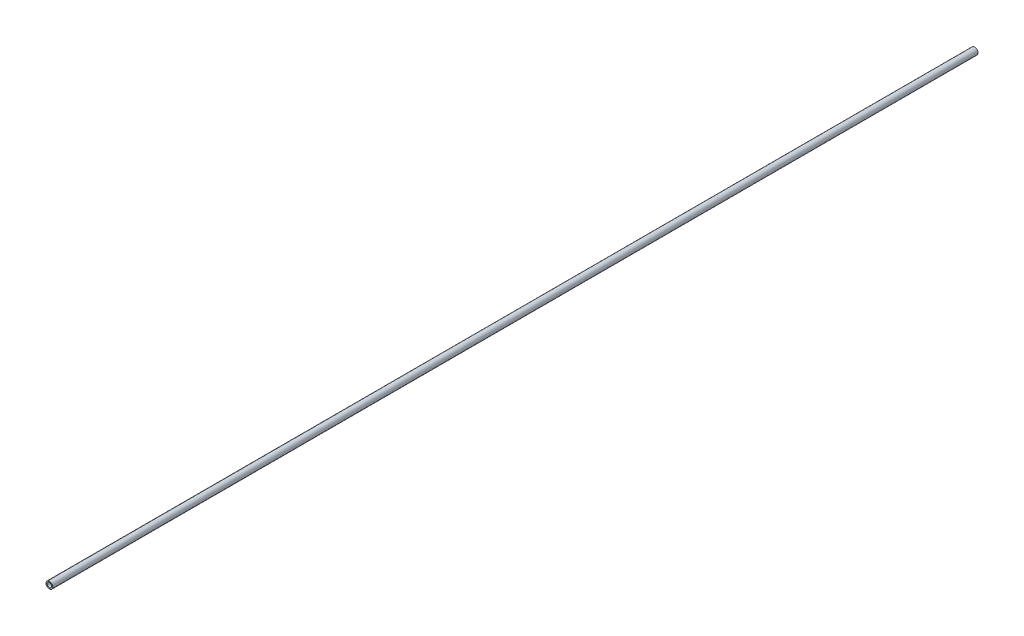
ISO-10303-21;
HEADER;
FILE_DESCRIPTION(('STEP AP214'),'2;1');
FILE_NAME('part.step','',(''),(''),'','','');
FILE_SCHEMA(('AUTOMOTIVE_DESIGN { 1 0 10303 214 1 1 1 1 }'));
ENDSEC;
DATA;
#1=APPLICATION_CONTEXT('core data for automotive mechanical design processes');
#2=APPLICATION_PROTOCOL_DEFINITION('international standard','automotive_design',2000,#1);
#3=PRODUCT_CONTEXT('',#1,'mechanical');
#4=PRODUCT('Part','Part','',(#3));
#5=PRODUCT_RELATED_PRODUCT_CATEGORY('part','',(#4));
#6=PRODUCT_DEFINITION_FORMATION('','',#4);
#7=PRODUCT_DEFINITION_CONTEXT('part definition',#1,'design');
#8=PRODUCT_DEFINITION('design','',#6,#7);
#9=PRODUCT_DEFINITION_SHAPE('','',#8);
#10=(LENGTH_UNIT() NAMED_UNIT(*) SI_UNIT(.MILLI.,.METRE.));
#11=(NAMED_UNIT(*) PLANE_ANGLE_UNIT() SI_UNIT($,.RADIAN.));
#12=(NAMED_UNIT(*) SI_UNIT($,.STERADIAN.) SOLID_ANGLE_UNIT());
#13=UNCERTAINTY_MEASURE_WITH_UNIT(LENGTH_MEASURE(1.E-05),#10,'distance_accuracy_value','');
#14=(GEOMETRIC_REPRESENTATION_CONTEXT(3) GLOBAL_UNCERTAINTY_ASSIGNED_CONTEXT((#13)) GLOBAL_UNIT_ASSIGNED_CONTEXT((#10,
#11,#12)) REPRESENTATION_CONTEXT('',''));
#15=CARTESIAN_POINT('',(0.,0.,0.));
#16=DIRECTION('',(0.,0.,1.));
#17=DIRECTION('',(1.,0.,0.));
#18=AXIS2_PLACEMENT_3D('',#15,#16,#17);
#19=CARTESIAN_POINT('',(0.,0.,820.));
#20=DIRECTION('',(0.,0.,1.));
#21=DIRECTION('',(1.,0.,0.));
#22=AXIS2_PLACEMENT_3D('',#19,#20,#21);
#23=PLANE('',#22);
#24=CARTESIAN_POINT('',(0.,0.,820.));
#25=DIRECTION('',(0.,0.,1.));
#26=DIRECTION('',(1.,0.,0.));
#27=AXIS2_PLACEMENT_3D('',#24,#25,#26);
#28=CIRCLE('',#27,3.);
#29=CARTESIAN_POINT('',(-3.,0.,820.));
#30=VERTEX_POINT('',#29);
#31=EDGE_CURVE('E10',#30,#30,#28,.T.);
#32=ORIENTED_EDGE('',*,*,#31,.T.);
#33=EDGE_LOOP('',(#32));
#34=FACE_BOUND('',#33,.T.);
#35=CARTESIAN_POINT('',(0.,0.,820.));
#36=DIRECTION('',(0.,0.,1.));
#37=DIRECTION('',(1.,0.,0.));
#38=AXIS2_PLACEMENT_3D('',#35,#36,#37);
#39=CIRCLE('',#38,2.);
#40=CARTESIAN_POINT('',(-2.,0.,820.));
#41=VERTEX_POINT('',#40);
#42=EDGE_CURVE('E50',#41,#41,#39,.T.);
#43=ORIENTED_EDGE('',*,*,#42,.F.);
#44=EDGE_LOOP('',(#43));
#45=FACE_BOUND('',#44,.T.);
#46=ADVANCED_FACE('F39',(#34,#45),#23,.T.);
#47=CARTESIAN_POINT('',(0.,0.,0.));
#48=DIRECTION('',(0.,0.,1.));
#49=DIRECTION('',(1.,0.,0.));
#50=AXIS2_PLACEMENT_3D('',#47,#48,#49);
#51=PLANE('',#50);
#52=CARTESIAN_POINT('',(0.,0.,0.));
#53=DIRECTION('',(0.,0.,1.));
#54=DIRECTION('',(1.,0.,0.));
#55=AXIS2_PLACEMENT_3D('',#52,#53,#54);
#56=CIRCLE('',#55,3.);
#57=CARTESIAN_POINT('',(-3.,0.,0.));
#58=VERTEX_POINT('',#57);
#59=EDGE_CURVE('E43',#58,#58,#56,.T.);
#60=ORIENTED_EDGE('',*,*,#59,.F.);
#61=EDGE_LOOP('',(#60));
#62=FACE_BOUND('',#61,.T.);
#63=CARTESIAN_POINT('',(0.,0.,0.));
#64=DIRECTION('',(0.,0.,1.));
#65=DIRECTION('',(1.,0.,0.));
#66=AXIS2_PLACEMENT_3D('',#63,#64,#65);
#67=CIRCLE('',#66,2.);
#68=CARTESIAN_POINT('',(-2.,0.,0.));
#69=VERTEX_POINT('',#68);
#70=EDGE_CURVE('E52',#69,#69,#67,.T.);
#71=ORIENTED_EDGE('',*,*,#70,.T.);
#72=EDGE_LOOP('',(#71));
#73=FACE_BOUND('',#72,.T.);
#74=ADVANCED_FACE('F62',(#62,#73),#51,.F.);
#75=CARTESIAN_POINT('',(0.,0.,820.));
#76=DIRECTION('',(0.,0.,-1.));
#77=DIRECTION('',(-1.,0.,0.));
#78=AXIS2_PLACEMENT_3D('',#75,#76,#77);
#79=CYLINDRICAL_SURFACE('',#78,3.);
#80=CARTESIAN_POINT('',(-3.,0.,820.));
#81=CARTESIAN_POINT('',(-3.,0.,811.458333333333));
#82=CARTESIAN_POINT('',(-3.,0.,802.916666666667));
#83=CARTESIAN_POINT('',(-3.,0.,785.833333333333));
#84=CARTESIAN_POINT('',(-3.,0.,777.291666666667));
#85=CARTESIAN_POINT('',(-3.,0.,760.208333333333));
#86=CARTESIAN_POINT('',(-3.,0.,751.666666666667));
#87=CARTESIAN_POINT('',(-3.,0.,734.583333333333));
#88=CARTESIAN_POINT('',(-3.,0.,726.041666666667));
#89=CARTESIAN_POINT('',(-3.,0.,708.958333333333));
#90=CARTESIAN_POINT('',(-3.,0.,700.416666666667));
#91=CARTESIAN_POINT('',(-3.,0.,683.333333333333));
#92=CARTESIAN_POINT('',(-3.,0.,674.791666666667));
#93=CARTESIAN_POINT('',(-3.,0.,657.708333333333));
#94=CARTESIAN_POINT('',(-3.,0.,649.166666666667));
#95=CARTESIAN_POINT('',(-3.,0.,632.083333333333));
#96=CARTESIAN_POINT('',(-3.,0.,623.541666666667));
#97=CARTESIAN_POINT('',(-3.,0.,606.458333333333));
#98=CARTESIAN_POINT('',(-3.,0.,597.916666666667));
#99=CARTESIAN_POINT('',(-3.,0.,580.833333333333));
#100=CARTESIAN_POINT('',(-3.,0.,572.291666666667));
#101=CARTESIAN_POINT('',(-3.,0.,555.208333333333));
#102=CARTESIAN_POINT('',(-3.,0.,546.666666666667));
#103=CARTESIAN_POINT('',(-3.,0.,529.583333333333));
#104=CARTESIAN_POINT('',(-3.,0.,521.041666666667));
#105=CARTESIAN_POINT('',(-3.,0.,503.958333333333));
#106=CARTESIAN_POINT('',(-3.,0.,495.416666666667));
#107=CARTESIAN_POINT('',(-3.,0.,478.333333333333));
#108=CARTESIAN_POINT('',(-3.,0.,469.791666666667));
#109=CARTESIAN_POINT('',(-3.,0.,452.708333333333));
#110=CARTESIAN_POINT('',(-3.,0.,444.166666666667));
#111=CARTESIAN_POINT('',(-3.,0.,427.083333333333));
#112=CARTESIAN_POINT('',(-3.,0.,418.541666666667));
#113=CARTESIAN_POINT('',(-3.,0.,401.458333333333));
#114=CARTESIAN_POINT('',(-3.,0.,392.916666666667));
#115=CARTESIAN_POINT('',(-3.,0.,375.833333333333));
#116=CARTESIAN_POINT('',(-3.,0.,367.291666666667));
#117=CARTESIAN_POINT('',(-3.,0.,350.208333333333));
#118=CARTESIAN_POINT('',(-3.,0.,341.666666666667));
#119=CARTESIAN_POINT('',(-3.,0.,324.583333333333));
#120=CARTESIAN_POINT('',(-3.,0.,316.041666666667));
#121=CARTESIAN_POINT('',(-3.,0.,298.958333333333));
#122=CARTESIAN_POINT('',(-3.,0.,290.416666666667));
#123=CARTESIAN_POINT('',(-3.,0.,273.333333333333));
#124=CARTESIAN_POINT('',(-3.,0.,264.791666666667));
#125=CARTESIAN_POINT('',(-3.,0.,247.708333333333));
#126=CARTESIAN_POINT('',(-3.,0.,239.166666666667));
#127=CARTESIAN_POINT('',(-3.,0.,222.083333333333));
#128=CARTESIAN_POINT('',(-3.,0.,213.541666666667));
#129=CARTESIAN_POINT('',(-3.,0.,196.458333333333));
#130=CARTESIAN_POINT('',(-3.,0.,187.916666666667));
#131=CARTESIAN_POINT('',(-3.,0.,170.833333333333));
#132=CARTESIAN_POINT('',(-3.,0.,162.291666666667));
#133=CARTESIAN_POINT('',(-3.,0.,145.208333333333));
#134=CARTESIAN_POINT('',(-3.,0.,136.666666666667));
#135=CARTESIAN_POINT('',(-3.,0.,119.583333333333));
#136=CARTESIAN_POINT('',(-3.,0.,111.041666666667));
#137=CARTESIAN_POINT('',(-3.,0.,93.9583333333334));
#138=CARTESIAN_POINT('',(-3.,0.,85.4166666666667));
#139=CARTESIAN_POINT('',(-3.,0.,68.3333333333334));
#140=CARTESIAN_POINT('',(-3.,0.,59.7916666666667));
#141=CARTESIAN_POINT('',(-3.,0.,42.7083333333333));
#142=CARTESIAN_POINT('',(-3.,0.,34.1666666666667));
#143=CARTESIAN_POINT('',(-3.,0.,17.0833333333333));
#144=CARTESIAN_POINT('',(-3.,0.,8.54166666666666));
#145=CARTESIAN_POINT('',(-3.,0.,0.));
#146=B_SPLINE_CURVE_WITH_KNOTS('',3,(#80,#81,#82,#83,#84,#85,#86,#87,#88,#89,#90,#91,#92,#93,
#94,#95,#96,#97,#98,#99,#100,#101,#102,#103,#104,#105,#106,#107,#108,#109,#110,#111,#112,#113,
#114,#115,#116,#117,#118,#119,#120,#121,#122,#123,#124,#125,#126,#127,#128,#129,#130,#131,#132,
#133,#134,#135,#136,#137,#138,#139,#140,#141,#142,#143,#144,#145),.UNSPECIFIED.,.F.,.F.,(4,2,2,
2,2,2,2,2,2,2,2,2,2,2,2,2,2,2,2,2,2,2,2,2,2,2,2,2,2,2,2,2,4),(0.,25.6249999999999,
51.2499999999999,76.8749999999999,102.5,128.125,153.75,179.375,205.,230.625,256.25,281.875,
307.5,333.125,358.75,384.375,410.,435.625,461.25,486.875,512.5,538.125,563.75,589.375,615.,
640.625,666.25,691.875,717.5,743.125,768.75,794.375,820.),.UNSPECIFIED.);
#147=EDGE_CURVE('BSEAM41',#30,#58,#146,.T.);
#148=ORIENTED_EDGE('',*,*,#31,.F.);
#149=ORIENTED_EDGE('',*,*,#59,.T.);
#150=ORIENTED_EDGE('',*,*,#147,.T.);
#151=ORIENTED_EDGE('',*,*,#147,.F.);
#152=EDGE_LOOP('',(#148,#150,#149,#151));
#153=FACE_BOUND('',#152,.T.);
#154=ADVANCED_FACE('F41',(#153),#79,.T.);
#155=CARTESIAN_POINT('',(0.,0.,820.));
#156=DIRECTION('',(0.,0.,-1.));
#157=DIRECTION('',(-1.,0.,0.));
#158=AXIS2_PLACEMENT_3D('',#155,#156,#157);
#159=CYLINDRICAL_SURFACE('',#158,2.);
#160=CARTESIAN_POINT('',(-2.,0.,820.));
#161=CARTESIAN_POINT('',(-2.,0.,811.458333333333));
#162=CARTESIAN_POINT('',(-2.,0.,802.916666666667));
#163=CARTESIAN_POINT('',(-2.,0.,785.833333333333));
#164=CARTESIAN_POINT('',(-2.,0.,777.291666666667));
#165=CARTESIAN_POINT('',(-2.,0.,760.208333333333));
#166=CARTESIAN_POINT('',(-2.,0.,751.666666666667));
#167=CARTESIAN_POINT('',(-2.,0.,734.583333333333));
#168=CARTESIAN_POINT('',(-2.,0.,726.041666666667));
#169=CARTESIAN_POINT('',(-2.,0.,708.958333333333));
#170=CARTESIAN_POINT('',(-2.,0.,700.416666666667));
#171=CARTESIAN_POINT('',(-2.,0.,683.333333333333));
#172=CARTESIAN_POINT('',(-2.,0.,674.791666666667));
#173=CARTESIAN_POINT('',(-2.,0.,657.708333333333));
#174=CARTESIAN_POINT('',(-2.,0.,649.166666666667));
#175=CARTESIAN_POINT('',(-2.,0.,632.083333333333));
#176=CARTESIAN_POINT('',(-2.,0.,623.541666666667));
#177=CARTESIAN_POINT('',(-2.,0.,606.458333333333));
#178=CARTESIAN_POINT('',(-2.,0.,597.916666666667));
#179=CARTESIAN_POINT('',(-2.,0.,580.833333333333));
#180=CARTESIAN_POINT('',(-2.,0.,572.291666666667));
#181=CARTESIAN_POINT('',(-2.,0.,555.208333333333));
#182=CARTESIAN_POINT('',(-2.,0.,546.666666666667));
#183=CARTESIAN_POINT('',(-2.,0.,529.583333333333));
#184=CARTESIAN_POINT('',(-2.,0.,521.041666666667));
#185=CARTESIAN_POINT('',(-2.,0.,503.958333333333));
#186=CARTESIAN_POINT('',(-2.,0.,495.416666666667));
#187=CARTESIAN_POINT('',(-2.,0.,478.333333333333));
#188=CARTESIAN_POINT('',(-2.,0.,469.791666666667));
#189=CARTESIAN_POINT('',(-2.,0.,452.708333333333));
#190=CARTESIAN_POINT('',(-2.,0.,444.166666666667));
#191=CARTESIAN_POINT('',(-2.,0.,427.083333333333));
#192=CARTESIAN_POINT('',(-2.,0.,418.541666666667));
#193=CARTESIAN_POINT('',(-2.,0.,401.458333333333));
#194=CARTESIAN_POINT('',(-2.,0.,392.916666666667));
#195=CARTESIAN_POINT('',(-2.,0.,375.833333333333));
#196=CARTESIAN_POINT('',(-2.,0.,367.291666666667));
#197=CARTESIAN_POINT('',(-2.,0.,350.208333333333));
#198=CARTESIAN_POINT('',(-2.,0.,341.666666666667));
#199=CARTESIAN_POINT('',(-2.,0.,324.583333333333));
#200=CARTESIAN_POINT('',(-2.,0.,316.041666666667));
#201=CARTESIAN_POINT('',(-2.,0.,298.958333333333));
#202=CARTESIAN_POINT('',(-2.,0.,290.416666666667));
#203=CARTESIAN_POINT('',(-2.,0.,273.333333333333));
#204=CARTESIAN_POINT('',(-2.,0.,264.791666666667));
#205=CARTESIAN_POINT('',(-2.,0.,247.708333333333));
#206=CARTESIAN_POINT('',(-2.,0.,239.166666666667));
#207=CARTESIAN_POINT('',(-2.,0.,222.083333333333));
#208=CARTESIAN_POINT('',(-2.,0.,213.541666666667));
#209=CARTESIAN_POINT('',(-2.,0.,196.458333333333));
#210=CARTESIAN_POINT('',(-2.,0.,187.916666666667));
#211=CARTESIAN_POINT('',(-2.,0.,170.833333333333));
#212=CARTESIAN_POINT('',(-2.,0.,162.291666666667));
#213=CARTESIAN_POINT('',(-2.,0.,145.208333333333));
#214=CARTESIAN_POINT('',(-2.,0.,136.666666666667));
#215=CARTESIAN_POINT('',(-2.,0.,119.583333333333));
#216=CARTESIAN_POINT('',(-2.,0.,111.041666666667));
#217=CARTESIAN_POINT('',(-2.,0.,93.9583333333334));
#218=CARTESIAN_POINT('',(-2.,0.,85.4166666666667));
#219=CARTESIAN_POINT('',(-2.,0.,68.3333333333334));
#220=CARTESIAN_POINT('',(-2.,0.,59.7916666666667));
#221=CARTESIAN_POINT('',(-2.,0.,42.7083333333333));
#222=CARTESIAN_POINT('',(-2.,0.,34.1666666666667));
#223=CARTESIAN_POINT('',(-2.,0.,17.0833333333333));
#224=CARTESIAN_POINT('',(-2.,0.,8.54166666666666));
#225=CARTESIAN_POINT('',(-2.,0.,0.));
#226=B_SPLINE_CURVE_WITH_KNOTS('',3,(#160,#161,#162,#163,#164,#165,#166,#167,#168,#169,#170,
#171,#172,#173,#174,#175,#176,#177,#178,#179,#180,#181,#182,#183,#184,#185,#186,#187,#188,#189,
#190,#191,#192,#193,#194,#195,#196,#197,#198,#199,#200,#201,#202,#203,#204,#205,#206,#207,#208,
#209,#210,#211,#212,#213,#214,#215,#216,#217,#218,#219,#220,#221,#222,#223,#224,#225),
.UNSPECIFIED.,.F.,.F.,(4,2,2,2,2,2,2,2,2,2,2,2,2,2,2,2,2,2,2,2,2,2,2,2,2,2,2,2,2,2,2,2,4),(0.,
25.6249999999999,51.2499999999999,76.8749999999999,102.5,128.125,153.75,179.375,205.,230.625,
256.25,281.875,307.5,333.125,358.75,384.375,410.,435.625,461.25,486.875,512.5,538.125,563.75,
589.375,615.,640.625,666.25,691.875,717.5,743.125,768.75,794.375,820.),.UNSPECIFIED.);
#227=EDGE_CURVE('BSEAM58',#41,#69,#226,.T.);
#228=ORIENTED_EDGE('',*,*,#42,.T.);
#229=ORIENTED_EDGE('',*,*,#70,.F.);
#230=ORIENTED_EDGE('',*,*,#227,.T.);
#231=ORIENTED_EDGE('',*,*,#227,.F.);
#232=EDGE_LOOP('',(#228,#230,#229,#231));
#233=FACE_BOUND('',#232,.T.);
#234=ADVANCED_FACE('F58',(#233),#159,.F.);
#235=CLOSED_SHELL('',(#46,#74,#154,#234));
#236=MANIFOLD_SOLID_BREP('B2',#235);
#237=ADVANCED_BREP_SHAPE_REPRESENTATION('',(#18,#236),#14);
#238=SHAPE_DEFINITION_REPRESENTATION(#9,#237);
ENDSEC;
END-ISO-10303-21;
